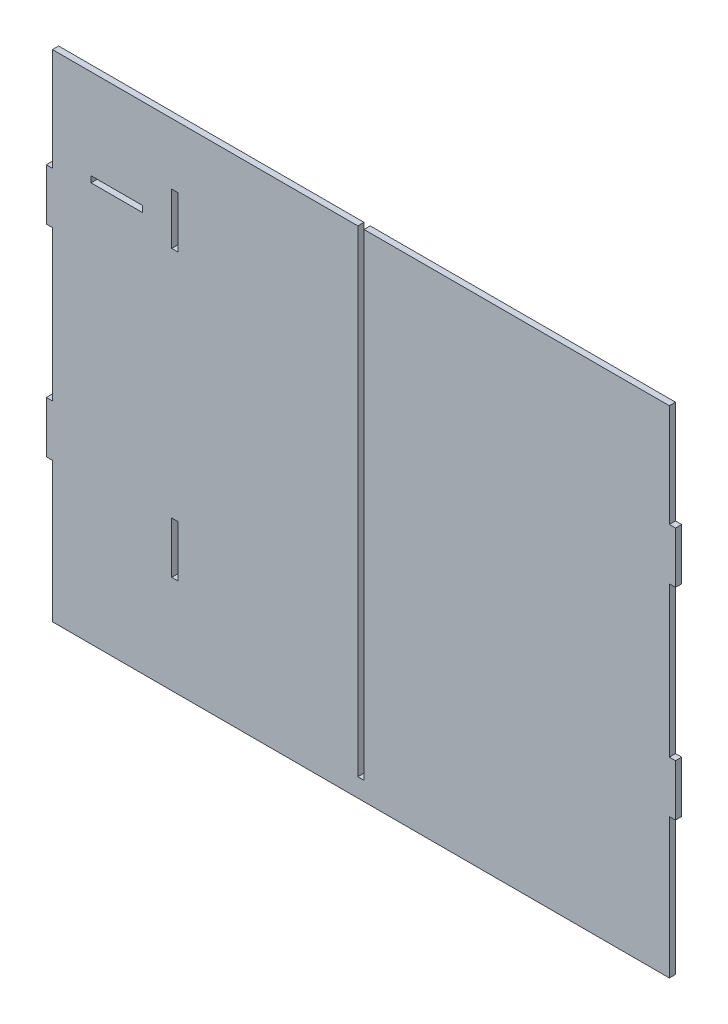
ISO-10303-21;
HEADER;
FILE_DESCRIPTION(('STEP AP214'),'2;1');
FILE_NAME('part.step','',(''),(''),'','','');
FILE_SCHEMA(('AUTOMOTIVE_DESIGN { 1 0 10303 214 1 1 1 1 }'));
ENDSEC;
DATA;
#1=APPLICATION_CONTEXT('core data for automotive mechanical design processes');
#2=APPLICATION_PROTOCOL_DEFINITION('international standard','automotive_design',2000,#1);
#3=PRODUCT_CONTEXT('',#1,'mechanical');
#4=PRODUCT('Part','Part','',(#3));
#5=PRODUCT_RELATED_PRODUCT_CATEGORY('part','',(#4));
#6=PRODUCT_DEFINITION_FORMATION('','',#4);
#7=PRODUCT_DEFINITION_CONTEXT('part definition',#1,'design');
#8=PRODUCT_DEFINITION('design','',#6,#7);
#9=PRODUCT_DEFINITION_SHAPE('','',#8);
#10=(LENGTH_UNIT() NAMED_UNIT(*) SI_UNIT(.MILLI.,.METRE.));
#11=(NAMED_UNIT(*) PLANE_ANGLE_UNIT() SI_UNIT($,.RADIAN.));
#12=(NAMED_UNIT(*) SI_UNIT($,.STERADIAN.) SOLID_ANGLE_UNIT());
#13=UNCERTAINTY_MEASURE_WITH_UNIT(LENGTH_MEASURE(1.E-05),#10,'distance_accuracy_value','');
#14=(GEOMETRIC_REPRESENTATION_CONTEXT(3) GLOBAL_UNCERTAINTY_ASSIGNED_CONTEXT((#13)) GLOBAL_UNIT_ASSIGNED_CONTEXT((#10,
#11,#12)) REPRESENTATION_CONTEXT('',''));
#15=CARTESIAN_POINT('',(0.,0.,0.));
#16=DIRECTION('',(0.,0.,1.));
#17=DIRECTION('',(1.,0.,0.));
#18=AXIS2_PLACEMENT_3D('',#15,#16,#17);
#19=CARTESIAN_POINT('',(0.,0.,6.));
#20=DIRECTION('',(0.,0.,-1.));
#21=DIRECTION('',(-1.,0.,0.));
#22=AXIS2_PLACEMENT_3D('',#19,#20,#21);
#23=PLANE('',#22);
#24=DIRECTION('',(0.,-1.,0.));
#25=VECTOR('',#24,1.);
#26=CARTESIAN_POINT('',(116.,-386.5,6.));
#27=LINE('',#26,#25);
#28=CARTESIAN_POINT('',(116.,-336.5,6.));
#29=VERTEX_POINT('',#28);
#30=CARTESIAN_POINT('',(116.,-386.5,6.));
#31=VERTEX_POINT('',#30);
#32=EDGE_CURVE('E302',#29,#31,#27,.T.);
#33=ORIENTED_EDGE('',*,*,#32,.F.);
#34=DIRECTION('',(-1.,0.,0.));
#35=VECTOR('',#34,1.);
#36=CARTESIAN_POINT('',(116.,-336.5,6.));
#37=LINE('',#36,#35);
#38=CARTESIAN_POINT('',(122.,-336.5,6.));
#39=VERTEX_POINT('',#38);
#40=EDGE_CURVE('E310',#39,#29,#37,.T.);
#41=ORIENTED_EDGE('',*,*,#40,.F.);
#42=DIRECTION('',(0.,1.,0.));
#43=VECTOR('',#42,1.);
#44=CARTESIAN_POINT('',(122.,-386.5,6.));
#45=LINE('',#44,#43);
#46=CARTESIAN_POINT('',(122.,-386.5,6.));
#47=VERTEX_POINT('',#46);
#48=EDGE_CURVE('E307',#47,#39,#45,.T.);
#49=ORIENTED_EDGE('',*,*,#48,.F.);
#50=DIRECTION('',(1.,0.,0.));
#51=VECTOR('',#50,1.);
#52=CARTESIAN_POINT('',(116.,-386.5,6.));
#53=LINE('',#52,#51);
#54=EDGE_CURVE('E304',#31,#47,#53,.T.);
#55=ORIENTED_EDGE('',*,*,#54,.F.);
#56=EDGE_LOOP('',(#33,#41,#49,#55));
#57=FACE_BOUND('',#56,.T.);
#58=DIRECTION('',(0.,-1.,0.));
#59=VECTOR('',#58,1.);
#60=CARTESIAN_POINT('',(0.,0.,6.));
#61=LINE('',#60,#59);
#62=CARTESIAN_POINT('',(0.,0.,6.));
#63=VERTEX_POINT('',#62);
#64=CARTESIAN_POINT('',(0.,-100.,6.));
#65=VERTEX_POINT('',#64);
#66=EDGE_CURVE('E364',#63,#65,#61,.T.);
#67=ORIENTED_EDGE('',*,*,#66,.T.);
#68=DIRECTION('',(-1.,0.,0.));
#69=VECTOR('',#68,1.);
#70=CARTESIAN_POINT('',(0.,-100.,6.));
#71=LINE('',#70,#69);
#72=CARTESIAN_POINT('',(-5.99999999999989,-100.,6.));
#73=VERTEX_POINT('',#72);
#74=EDGE_CURVE('E367',#65,#73,#71,.T.);
#75=ORIENTED_EDGE('',*,*,#74,.T.);
#76=DIRECTION('',(0.,-1.,0.));
#77=VECTOR('',#76,1.);
#78=CARTESIAN_POINT('',(-5.99999999999989,-100.,6.));
#79=LINE('',#78,#77);
#80=CARTESIAN_POINT('',(-5.99999999999989,-150.,6.));
#81=VERTEX_POINT('',#80);
#82=EDGE_CURVE('E370',#73,#81,#79,.T.);
#83=ORIENTED_EDGE('',*,*,#82,.T.);
#84=DIRECTION('',(1.,0.,0.));
#85=VECTOR('',#84,1.);
#86=CARTESIAN_POINT('',(0.,-150.,6.));
#87=LINE('',#86,#85);
#88=CARTESIAN_POINT('',(0.,-150.,6.));
#89=VERTEX_POINT('',#88);
#90=EDGE_CURVE('E372',#81,#89,#87,.T.);
#91=ORIENTED_EDGE('',*,*,#90,.T.);
#92=DIRECTION('',(0.,-1.,0.));
#93=VECTOR('',#92,1.);
#94=CARTESIAN_POINT('',(0.,-150.,6.));
#95=LINE('',#94,#93);
#96=CARTESIAN_POINT('',(0.,-296.,6.));
#97=VERTEX_POINT('',#96);
#98=EDGE_CURVE('E374',#89,#97,#95,.T.);
#99=ORIENTED_EDGE('',*,*,#98,.T.);
#100=DIRECTION('',(-1.,0.,0.));
#101=VECTOR('',#100,1.);
#102=CARTESIAN_POINT('',(0.,-296.,6.));
#103=LINE('',#102,#101);
#104=CARTESIAN_POINT('',(-5.99999999999988,-296.,6.));
#105=VERTEX_POINT('',#104);
#106=EDGE_CURVE('E376',#97,#105,#103,.T.);
#107=ORIENTED_EDGE('',*,*,#106,.T.);
#108=DIRECTION('',(0.,-1.,0.));
#109=VECTOR('',#108,1.);
#110=CARTESIAN_POINT('',(-5.99999999999986,-346.,6.));
#111=LINE('',#110,#109);
#112=CARTESIAN_POINT('',(-5.99999999999986,-346.,6.));
#113=VERTEX_POINT('',#112);
#114=EDGE_CURVE('E378',#105,#113,#111,.T.);
#115=ORIENTED_EDGE('',*,*,#114,.T.);
#116=DIRECTION('',(1.,0.,0.));
#117=VECTOR('',#116,1.);
#118=CARTESIAN_POINT('',(0.,-346.,6.));
#119=LINE('',#118,#117);
#120=CARTESIAN_POINT('',(0.,-346.,6.));
#121=VERTEX_POINT('',#120);
#122=EDGE_CURVE('E380',#113,#121,#119,.T.);
#123=ORIENTED_EDGE('',*,*,#122,.T.);
#124=DIRECTION('',(0.,-1.,0.));
#125=VECTOR('',#124,1.);
#126=CARTESIAN_POINT('',(0.,-346.,6.));
#127=LINE('',#126,#125);
#128=CARTESIAN_POINT('',(0.,-482.,6.));
#129=VERTEX_POINT('',#128);
#130=EDGE_CURVE('E382',#121,#129,#127,.T.);
#131=ORIENTED_EDGE('',*,*,#130,.T.);
#132=DIRECTION('',(1.,0.,0.));
#133=VECTOR('',#132,1.);
#134=CARTESIAN_POINT('',(0.,-482.,6.));
#135=LINE('',#134,#133);
#136=CARTESIAN_POINT('',(600.,-482.,6.));
#137=VERTEX_POINT('',#136);
#138=EDGE_CURVE('E384',#129,#137,#135,.T.);
#139=ORIENTED_EDGE('',*,*,#138,.T.);
#140=DIRECTION('',(0.,1.,0.));
#141=VECTOR('',#140,1.);
#142=CARTESIAN_POINT('',(600.,-346.,6.));
#143=LINE('',#142,#141);
#144=CARTESIAN_POINT('',(600.,-346.,6.));
#145=VERTEX_POINT('',#144);
#146=EDGE_CURVE('E386',#137,#145,#143,.T.);
#147=ORIENTED_EDGE('',*,*,#146,.T.);
#148=DIRECTION('',(1.,0.,0.));
#149=VECTOR('',#148,1.);
#150=CARTESIAN_POINT('',(600.,-346.,6.));
#151=LINE('',#150,#149);
#152=CARTESIAN_POINT('',(606.,-346.,6.));
#153=VERTEX_POINT('',#152);
#154=EDGE_CURVE('E388',#145,#153,#151,.T.);
#155=ORIENTED_EDGE('',*,*,#154,.T.);
#156=DIRECTION('',(0.,1.,0.));
#157=VECTOR('',#156,1.);
#158=CARTESIAN_POINT('',(606.,-346.,6.));
#159=LINE('',#158,#157);
#160=CARTESIAN_POINT('',(606.,-296.,6.));
#161=VERTEX_POINT('',#160);
#162=EDGE_CURVE('E390',#153,#161,#159,.T.);
#163=ORIENTED_EDGE('',*,*,#162,.T.);
#164=DIRECTION('',(-1.,0.,0.));
#165=VECTOR('',#164,1.);
#166=CARTESIAN_POINT('',(600.,-296.,6.));
#167=LINE('',#166,#165);
#168=CARTESIAN_POINT('',(600.,-296.,6.));
#169=VERTEX_POINT('',#168);
#170=EDGE_CURVE('E392',#161,#169,#167,.T.);
#171=ORIENTED_EDGE('',*,*,#170,.T.);
#172=DIRECTION('',(0.,1.,0.));
#173=VECTOR('',#172,1.);
#174=CARTESIAN_POINT('',(600.,-150.,6.));
#175=LINE('',#174,#173);
#176=CARTESIAN_POINT('',(600.,-150.,6.));
#177=VERTEX_POINT('',#176);
#178=EDGE_CURVE('E394',#169,#177,#175,.T.);
#179=ORIENTED_EDGE('',*,*,#178,.T.);
#180=DIRECTION('',(1.,0.,0.));
#181=VECTOR('',#180,1.);
#182=CARTESIAN_POINT('',(600.,-150.,6.));
#183=LINE('',#182,#181);
#184=CARTESIAN_POINT('',(606.,-150.,6.));
#185=VERTEX_POINT('',#184);
#186=EDGE_CURVE('E396',#177,#185,#183,.T.);
#187=ORIENTED_EDGE('',*,*,#186,.T.);
#188=DIRECTION('',(0.,1.,0.));
#189=VECTOR('',#188,1.);
#190=CARTESIAN_POINT('',(606.,-100.,6.));
#191=LINE('',#190,#189);
#192=CARTESIAN_POINT('',(606.,-100.,6.));
#193=VERTEX_POINT('',#192);
#194=EDGE_CURVE('E398',#185,#193,#191,.T.);
#195=ORIENTED_EDGE('',*,*,#194,.T.);
#196=DIRECTION('',(-1.,0.,0.));
#197=VECTOR('',#196,1.);
#198=CARTESIAN_POINT('',(600.,-100.,6.));
#199=LINE('',#198,#197);
#200=CARTESIAN_POINT('',(600.,-100.,6.));
#201=VERTEX_POINT('',#200);
#202=EDGE_CURVE('E400',#193,#201,#199,.T.);
#203=ORIENTED_EDGE('',*,*,#202,.T.);
#204=DIRECTION('',(0.,1.,0.));
#205=VECTOR('',#204,1.);
#206=CARTESIAN_POINT('',(600.,0.,6.));
#207=LINE('',#206,#205);
#208=CARTESIAN_POINT('',(600.,0.,6.));
#209=VERTEX_POINT('',#208);
#210=EDGE_CURVE('E402',#201,#209,#207,.T.);
#211=ORIENTED_EDGE('',*,*,#210,.T.);
#212=DIRECTION('',(-1.,0.,0.));
#213=VECTOR('',#212,1.);
#214=CARTESIAN_POINT('',(303.,0.,6.));
#215=LINE('',#214,#213);
#216=CARTESIAN_POINT('',(303.,0.,6.));
#217=VERTEX_POINT('',#216);
#218=EDGE_CURVE('E404',#209,#217,#215,.T.);
#219=ORIENTED_EDGE('',*,*,#218,.T.);
#220=DIRECTION('',(0.,-1.,0.));
#221=VECTOR('',#220,1.);
#222=CARTESIAN_POINT('',(303.,0.,6.));
#223=LINE('',#222,#221);
#224=CARTESIAN_POINT('',(303.,-464.,6.));
#225=VERTEX_POINT('',#224);
#226=EDGE_CURVE('E406',#217,#225,#223,.T.);
#227=ORIENTED_EDGE('',*,*,#226,.T.);
#228=DIRECTION('',(-1.,0.,0.));
#229=VECTOR('',#228,1.);
#230=CARTESIAN_POINT('',(297.,-464.,6.));
#231=LINE('',#230,#229);
#232=CARTESIAN_POINT('',(297.,-464.,6.));
#233=VERTEX_POINT('',#232);
#234=EDGE_CURVE('E408',#225,#233,#231,.T.);
#235=ORIENTED_EDGE('',*,*,#234,.T.);
#236=DIRECTION('',(0.,1.,0.));
#237=VECTOR('',#236,1.);
#238=CARTESIAN_POINT('',(297.,0.,6.));
#239=LINE('',#238,#237);
#240=CARTESIAN_POINT('',(297.,0.,6.));
#241=VERTEX_POINT('',#240);
#242=EDGE_CURVE('E410',#233,#241,#239,.T.);
#243=ORIENTED_EDGE('',*,*,#242,.T.);
#244=DIRECTION('',(-1.,0.,0.));
#245=VECTOR('',#244,1.);
#246=CARTESIAN_POINT('',(0.,0.,6.));
#247=LINE('',#246,#245);
#248=EDGE_CURVE('E412',#241,#63,#247,.T.);
#249=ORIENTED_EDGE('',*,*,#248,.T.);
#250=EDGE_LOOP('',(#67,#75,#83,#91,#99,#107,#115,#123,#131,#139,#147,#155,#163,#171,#179,#187,
#195,#203,#211,#219,#227,#235,#243,#249));
#251=FACE_BOUND('',#250,.T.);
#252=DIRECTION('',(0.,1.,0.));
#253=VECTOR('',#252,1.);
#254=CARTESIAN_POINT('',(122.,-59.5,6.));
#255=LINE('',#254,#253);
#256=CARTESIAN_POINT('',(122.,-109.5,6.));
#257=VERTEX_POINT('',#256);
#258=CARTESIAN_POINT('',(122.,-59.5,6.));
#259=VERTEX_POINT('',#258);
#260=EDGE_CURVE('E333',#257,#259,#255,.T.);
#261=ORIENTED_EDGE('',*,*,#260,.F.);
#262=DIRECTION('',(1.,0.,0.));
#263=VECTOR('',#262,1.);
#264=CARTESIAN_POINT('',(116.,-109.5,6.));
#265=LINE('',#264,#263);
#266=CARTESIAN_POINT('',(116.,-109.5,6.));
#267=VERTEX_POINT('',#266);
#268=EDGE_CURVE('E341',#267,#257,#265,.T.);
#269=ORIENTED_EDGE('',*,*,#268,.F.);
#270=DIRECTION('',(0.,-1.,0.));
#271=VECTOR('',#270,1.);
#272=CARTESIAN_POINT('',(116.,-59.5,6.));
#273=LINE('',#272,#271);
#274=CARTESIAN_POINT('',(116.,-59.5,6.));
#275=VERTEX_POINT('',#274);
#276=EDGE_CURVE('E338',#275,#267,#273,.T.);
#277=ORIENTED_EDGE('',*,*,#276,.F.);
#278=DIRECTION('',(-1.,0.,0.));
#279=VECTOR('',#278,1.);
#280=CARTESIAN_POINT('',(116.,-59.5,6.));
#281=LINE('',#280,#279);
#282=EDGE_CURVE('E335',#259,#275,#281,.T.);
#283=ORIENTED_EDGE('',*,*,#282,.F.);
#284=EDGE_LOOP('',(#261,#269,#277,#283));
#285=FACE_BOUND('',#284,.T.);
#286=DIRECTION('',(0.,1.,0.));
#287=VECTOR('',#286,1.);
#288=CARTESIAN_POINT('',(87.5,-87.5,6.));
#289=LINE('',#288,#287);
#290=CARTESIAN_POINT('',(87.5,-93.5,6.));
#291=VERTEX_POINT('',#290);
#292=CARTESIAN_POINT('',(87.5,-87.5,6.));
#293=VERTEX_POINT('',#292);
#294=EDGE_CURVE('E266',#291,#293,#289,.T.);
#295=ORIENTED_EDGE('',*,*,#294,.F.);
#296=DIRECTION('',(1.,0.,0.));
#297=VECTOR('',#296,1.);
#298=CARTESIAN_POINT('',(37.5,-93.5,6.));
#299=LINE('',#298,#297);
#300=CARTESIAN_POINT('',(37.5,-93.5,6.));
#301=VERTEX_POINT('',#300);
#302=EDGE_CURVE('E288',#301,#291,#299,.T.);
#303=ORIENTED_EDGE('',*,*,#302,.F.);
#304=DIRECTION('',(0.,-1.,0.));
#305=VECTOR('',#304,1.);
#306=CARTESIAN_POINT('',(37.5,-87.5,6.));
#307=LINE('',#306,#305);
#308=CARTESIAN_POINT('',(37.5,-87.5,6.));
#309=VERTEX_POINT('',#308);
#310=EDGE_CURVE('E286',#309,#301,#307,.T.);
#311=ORIENTED_EDGE('',*,*,#310,.F.);
#312=DIRECTION('',(-1.,0.,0.));
#313=VECTOR('',#312,1.);
#314=CARTESIAN_POINT('',(37.5,-87.5,6.));
#315=LINE('',#314,#313);
#316=EDGE_CURVE('E274',#293,#309,#315,.T.);
#317=ORIENTED_EDGE('',*,*,#316,.F.);
#318=EDGE_LOOP('',(#295,#303,#311,#317));
#319=FACE_BOUND('',#318,.T.);
#320=ADVANCED_FACE('F33',(#57,#251,#285,#319),#23,.F.);
#321=CARTESIAN_POINT('',(0.,0.,0.));
#322=DIRECTION('',(0.,0.,-1.));
#323=DIRECTION('',(-1.,0.,0.));
#324=AXIS2_PLACEMENT_3D('',#321,#322,#323);
#325=PLANE('',#324);
#326=DIRECTION('',(0.,-1.,0.));
#327=VECTOR('',#326,1.);
#328=CARTESIAN_POINT('',(0.,0.,0.));
#329=LINE('',#328,#327);
#330=CARTESIAN_POINT('',(0.,0.,0.));
#331=VERTEX_POINT('',#330);
#332=CARTESIAN_POINT('',(0.,-100.,0.));
#333=VERTEX_POINT('',#332);
#334=EDGE_CURVE('E363',#331,#333,#329,.T.);
#335=ORIENTED_EDGE('',*,*,#334,.F.);
#336=DIRECTION('',(-1.,0.,0.));
#337=VECTOR('',#336,1.);
#338=CARTESIAN_POINT('',(0.,0.,0.));
#339=LINE('',#338,#337);
#340=CARTESIAN_POINT('',(297.,0.,0.));
#341=VERTEX_POINT('',#340);
#342=EDGE_CURVE('E368',#341,#331,#339,.T.);
#343=ORIENTED_EDGE('',*,*,#342,.F.);
#344=DIRECTION('',(0.,1.,0.));
#345=VECTOR('',#344,1.);
#346=CARTESIAN_POINT('',(297.,0.,0.));
#347=LINE('',#346,#345);
#348=CARTESIAN_POINT('',(297.,-464.,0.));
#349=VERTEX_POINT('',#348);
#350=EDGE_CURVE('E459',#349,#341,#347,.T.);
#351=ORIENTED_EDGE('',*,*,#350,.F.);
#352=DIRECTION('',(-1.,0.,0.));
#353=VECTOR('',#352,1.);
#354=CARTESIAN_POINT('',(297.,-464.,0.));
#355=LINE('',#354,#353);
#356=CARTESIAN_POINT('',(303.,-464.,0.));
#357=VERTEX_POINT('',#356);
#358=EDGE_CURVE('E457',#357,#349,#355,.T.);
#359=ORIENTED_EDGE('',*,*,#358,.F.);
#360=DIRECTION('',(0.,-1.,0.));
#361=VECTOR('',#360,1.);
#362=CARTESIAN_POINT('',(303.,0.,0.));
#363=LINE('',#362,#361);
#364=CARTESIAN_POINT('',(303.,0.,0.));
#365=VERTEX_POINT('',#364);
#366=EDGE_CURVE('E455',#365,#357,#363,.T.);
#367=ORIENTED_EDGE('',*,*,#366,.F.);
#368=DIRECTION('',(-1.,0.,0.));
#369=VECTOR('',#368,1.);
#370=CARTESIAN_POINT('',(303.,0.,0.));
#371=LINE('',#370,#369);
#372=CARTESIAN_POINT('',(600.,0.,0.));
#373=VERTEX_POINT('',#372);
#374=EDGE_CURVE('E453',#373,#365,#371,.T.);
#375=ORIENTED_EDGE('',*,*,#374,.F.);
#376=DIRECTION('',(0.,1.,0.));
#377=VECTOR('',#376,1.);
#378=CARTESIAN_POINT('',(600.,0.,0.));
#379=LINE('',#378,#377);
#380=CARTESIAN_POINT('',(600.,-100.,0.));
#381=VERTEX_POINT('',#380);
#382=EDGE_CURVE('E451',#381,#373,#379,.T.);
#383=ORIENTED_EDGE('',*,*,#382,.F.);
#384=DIRECTION('',(-1.,0.,0.));
#385=VECTOR('',#384,1.);
#386=CARTESIAN_POINT('',(600.,-100.,0.));
#387=LINE('',#386,#385);
#388=CARTESIAN_POINT('',(606.,-100.,0.));
#389=VERTEX_POINT('',#388);
#390=EDGE_CURVE('E449',#389,#381,#387,.T.);
#391=ORIENTED_EDGE('',*,*,#390,.F.);
#392=DIRECTION('',(0.,1.,0.));
#393=VECTOR('',#392,1.);
#394=CARTESIAN_POINT('',(606.,-100.,0.));
#395=LINE('',#394,#393);
#396=CARTESIAN_POINT('',(606.,-150.,0.));
#397=VERTEX_POINT('',#396);
#398=EDGE_CURVE('E447',#397,#389,#395,.T.);
#399=ORIENTED_EDGE('',*,*,#398,.F.);
#400=DIRECTION('',(1.,0.,0.));
#401=VECTOR('',#400,1.);
#402=CARTESIAN_POINT('',(600.,-150.,0.));
#403=LINE('',#402,#401);
#404=CARTESIAN_POINT('',(600.,-150.,0.));
#405=VERTEX_POINT('',#404);
#406=EDGE_CURVE('E445',#405,#397,#403,.T.);
#407=ORIENTED_EDGE('',*,*,#406,.F.);
#408=DIRECTION('',(0.,1.,0.));
#409=VECTOR('',#408,1.);
#410=CARTESIAN_POINT('',(600.,-150.,0.));
#411=LINE('',#410,#409);
#412=CARTESIAN_POINT('',(600.,-296.,0.));
#413=VERTEX_POINT('',#412);
#414=EDGE_CURVE('E443',#413,#405,#411,.T.);
#415=ORIENTED_EDGE('',*,*,#414,.F.);
#416=DIRECTION('',(-1.,0.,0.));
#417=VECTOR('',#416,1.);
#418=CARTESIAN_POINT('',(600.,-296.,0.));
#419=LINE('',#418,#417);
#420=CARTESIAN_POINT('',(606.,-296.,0.));
#421=VERTEX_POINT('',#420);
#422=EDGE_CURVE('E441',#421,#413,#419,.T.);
#423=ORIENTED_EDGE('',*,*,#422,.F.);
#424=DIRECTION('',(0.,1.,0.));
#425=VECTOR('',#424,1.);
#426=CARTESIAN_POINT('',(606.,-346.,0.));
#427=LINE('',#426,#425);
#428=CARTESIAN_POINT('',(606.,-346.,0.));
#429=VERTEX_POINT('',#428);
#430=EDGE_CURVE('E439',#429,#421,#427,.T.);
#431=ORIENTED_EDGE('',*,*,#430,.F.);
#432=DIRECTION('',(1.,0.,0.));
#433=VECTOR('',#432,1.);
#434=CARTESIAN_POINT('',(600.,-346.,0.));
#435=LINE('',#434,#433);
#436=CARTESIAN_POINT('',(600.,-346.,0.));
#437=VERTEX_POINT('',#436);
#438=EDGE_CURVE('E437',#437,#429,#435,.T.);
#439=ORIENTED_EDGE('',*,*,#438,.F.);
#440=DIRECTION('',(0.,1.,0.));
#441=VECTOR('',#440,1.);
#442=CARTESIAN_POINT('',(600.,-346.,0.));
#443=LINE('',#442,#441);
#444=CARTESIAN_POINT('',(600.,-482.,0.));
#445=VERTEX_POINT('',#444);
#446=EDGE_CURVE('E435',#445,#437,#443,.T.);
#447=ORIENTED_EDGE('',*,*,#446,.F.);
#448=DIRECTION('',(1.,0.,0.));
#449=VECTOR('',#448,1.);
#450=CARTESIAN_POINT('',(0.,-482.,0.));
#451=LINE('',#450,#449);
#452=CARTESIAN_POINT('',(0.,-482.,0.));
#453=VERTEX_POINT('',#452);
#454=EDGE_CURVE('E433',#453,#445,#451,.T.);
#455=ORIENTED_EDGE('',*,*,#454,.F.);
#456=DIRECTION('',(0.,-1.,0.));
#457=VECTOR('',#456,1.);
#458=CARTESIAN_POINT('',(0.,-346.,0.));
#459=LINE('',#458,#457);
#460=CARTESIAN_POINT('',(0.,-346.,0.));
#461=VERTEX_POINT('',#460);
#462=EDGE_CURVE('E431',#461,#453,#459,.T.);
#463=ORIENTED_EDGE('',*,*,#462,.F.);
#464=DIRECTION('',(1.,0.,0.));
#465=VECTOR('',#464,1.);
#466=CARTESIAN_POINT('',(0.,-346.,0.));
#467=LINE('',#466,#465);
#468=CARTESIAN_POINT('',(-5.99999999999986,-346.,0.));
#469=VERTEX_POINT('',#468);
#470=EDGE_CURVE('E429',#469,#461,#467,.T.);
#471=ORIENTED_EDGE('',*,*,#470,.F.);
#472=DIRECTION('',(0.,-1.,0.));
#473=VECTOR('',#472,1.);
#474=CARTESIAN_POINT('',(-5.99999999999986,-346.,0.));
#475=LINE('',#474,#473);
#476=CARTESIAN_POINT('',(-5.99999999999988,-296.,0.));
#477=VERTEX_POINT('',#476);
#478=EDGE_CURVE('E427',#477,#469,#475,.T.);
#479=ORIENTED_EDGE('',*,*,#478,.F.);
#480=DIRECTION('',(-1.,0.,0.));
#481=VECTOR('',#480,1.);
#482=CARTESIAN_POINT('',(0.,-296.,0.));
#483=LINE('',#482,#481);
#484=CARTESIAN_POINT('',(0.,-296.,0.));
#485=VERTEX_POINT('',#484);
#486=EDGE_CURVE('E425',#485,#477,#483,.T.);
#487=ORIENTED_EDGE('',*,*,#486,.F.);
#488=DIRECTION('',(0.,-1.,0.));
#489=VECTOR('',#488,1.);
#490=CARTESIAN_POINT('',(0.,-150.,0.));
#491=LINE('',#490,#489);
#492=CARTESIAN_POINT('',(0.,-150.,0.));
#493=VERTEX_POINT('',#492);
#494=EDGE_CURVE('E423',#493,#485,#491,.T.);
#495=ORIENTED_EDGE('',*,*,#494,.F.);
#496=DIRECTION('',(1.,0.,0.));
#497=VECTOR('',#496,1.);
#498=CARTESIAN_POINT('',(0.,-150.,0.));
#499=LINE('',#498,#497);
#500=CARTESIAN_POINT('',(-5.99999999999989,-150.,0.));
#501=VERTEX_POINT('',#500);
#502=EDGE_CURVE('E421',#501,#493,#499,.T.);
#503=ORIENTED_EDGE('',*,*,#502,.F.);
#504=DIRECTION('',(0.,-1.,0.));
#505=VECTOR('',#504,1.);
#506=CARTESIAN_POINT('',(-5.99999999999989,-100.,0.));
#507=LINE('',#506,#505);
#508=CARTESIAN_POINT('',(-5.99999999999989,-100.,0.));
#509=VERTEX_POINT('',#508);
#510=EDGE_CURVE('E419',#509,#501,#507,.T.);
#511=ORIENTED_EDGE('',*,*,#510,.F.);
#512=DIRECTION('',(-1.,0.,0.));
#513=VECTOR('',#512,1.);
#514=CARTESIAN_POINT('',(0.,-100.,0.));
#515=LINE('',#514,#513);
#516=EDGE_CURVE('E417',#333,#509,#515,.T.);
#517=ORIENTED_EDGE('',*,*,#516,.F.);
#518=EDGE_LOOP('',(#335,#343,#351,#359,#367,#375,#383,#391,#399,#407,#415,#423,#431,#439,#447,
#455,#463,#471,#479,#487,#495,#503,#511,#517));
#519=FACE_BOUND('',#518,.T.);
#520=DIRECTION('',(1.,0.,0.));
#521=VECTOR('',#520,1.);
#522=CARTESIAN_POINT('',(116.,-109.5,0.));
#523=LINE('',#522,#521);
#524=CARTESIAN_POINT('',(116.,-109.5,0.));
#525=VERTEX_POINT('',#524);
#526=CARTESIAN_POINT('',(122.,-109.5,0.));
#527=VERTEX_POINT('',#526);
#528=EDGE_CURVE('E336',#525,#527,#523,.T.);
#529=ORIENTED_EDGE('',*,*,#528,.T.);
#530=DIRECTION('',(0.,1.,0.));
#531=VECTOR('',#530,1.);
#532=CARTESIAN_POINT('',(122.,-59.5,0.));
#533=LINE('',#532,#531);
#534=CARTESIAN_POINT('',(122.,-59.5,0.));
#535=VERTEX_POINT('',#534);
#536=EDGE_CURVE('E332',#527,#535,#533,.T.);
#537=ORIENTED_EDGE('',*,*,#536,.T.);
#538=DIRECTION('',(-1.,0.,0.));
#539=VECTOR('',#538,1.);
#540=CARTESIAN_POINT('',(116.,-59.5,0.));
#541=LINE('',#540,#539);
#542=CARTESIAN_POINT('',(116.,-59.5,0.));
#543=VERTEX_POINT('',#542);
#544=EDGE_CURVE('E346',#535,#543,#541,.T.);
#545=ORIENTED_EDGE('',*,*,#544,.T.);
#546=DIRECTION('',(0.,-1.,0.));
#547=VECTOR('',#546,1.);
#548=CARTESIAN_POINT('',(116.,-59.5,0.));
#549=LINE('',#548,#547);
#550=EDGE_CURVE('E349',#543,#525,#549,.T.);
#551=ORIENTED_EDGE('',*,*,#550,.T.);
#552=EDGE_LOOP('',(#529,#537,#545,#551));
#553=FACE_BOUND('',#552,.T.);
#554=DIRECTION('',(-1.,0.,0.));
#555=VECTOR('',#554,1.);
#556=CARTESIAN_POINT('',(116.,-336.5,0.));
#557=LINE('',#556,#555);
#558=CARTESIAN_POINT('',(122.,-336.5,0.));
#559=VERTEX_POINT('',#558);
#560=CARTESIAN_POINT('',(116.,-336.5,0.));
#561=VERTEX_POINT('',#560);
#562=EDGE_CURVE('E305',#559,#561,#557,.T.);
#563=ORIENTED_EDGE('',*,*,#562,.T.);
#564=DIRECTION('',(0.,-1.,0.));
#565=VECTOR('',#564,1.);
#566=CARTESIAN_POINT('',(116.,-386.5,0.));
#567=LINE('',#566,#565);
#568=CARTESIAN_POINT('',(116.,-386.5,0.));
#569=VERTEX_POINT('',#568);
#570=EDGE_CURVE('E282',#561,#569,#567,.T.);
#571=ORIENTED_EDGE('',*,*,#570,.T.);
#572=DIRECTION('',(1.,0.,0.));
#573=VECTOR('',#572,1.);
#574=CARTESIAN_POINT('',(116.,-386.5,0.));
#575=LINE('',#574,#573);
#576=CARTESIAN_POINT('',(122.,-386.5,0.));
#577=VERTEX_POINT('',#576);
#578=EDGE_CURVE('E315',#569,#577,#575,.T.);
#579=ORIENTED_EDGE('',*,*,#578,.T.);
#580=DIRECTION('',(0.,1.,0.));
#581=VECTOR('',#580,1.);
#582=CARTESIAN_POINT('',(122.,-386.5,0.));
#583=LINE('',#582,#581);
#584=EDGE_CURVE('E318',#577,#559,#583,.T.);
#585=ORIENTED_EDGE('',*,*,#584,.T.);
#586=EDGE_LOOP('',(#563,#571,#579,#585));
#587=FACE_BOUND('',#586,.T.);
#588=DIRECTION('',(1.,0.,0.));
#589=VECTOR('',#588,1.);
#590=CARTESIAN_POINT('',(37.5,-93.5,0.));
#591=LINE('',#590,#589);
#592=CARTESIAN_POINT('',(37.5,-93.5,0.));
#593=VERTEX_POINT('',#592);
#594=CARTESIAN_POINT('',(87.5,-93.5,0.));
#595=VERTEX_POINT('',#594);
#596=EDGE_CURVE('E275',#593,#595,#591,.T.);
#597=ORIENTED_EDGE('',*,*,#596,.T.);
#598=DIRECTION('',(0.,1.,0.));
#599=VECTOR('',#598,1.);
#600=CARTESIAN_POINT('',(87.5,-87.5,0.));
#601=LINE('',#600,#599);
#602=CARTESIAN_POINT('',(87.5,-87.5,0.));
#603=VERTEX_POINT('',#602);
#604=EDGE_CURVE('E56',#595,#603,#601,.T.);
#605=ORIENTED_EDGE('',*,*,#604,.T.);
#606=DIRECTION('',(-1.,0.,0.));
#607=VECTOR('',#606,1.);
#608=CARTESIAN_POINT('',(37.5,-87.5,0.));
#609=LINE('',#608,#607);
#610=CARTESIAN_POINT('',(37.5,-87.5,0.));
#611=VERTEX_POINT('',#610);
#612=EDGE_CURVE('E281',#603,#611,#609,.T.);
#613=ORIENTED_EDGE('',*,*,#612,.T.);
#614=DIRECTION('',(0.,-1.,0.));
#615=VECTOR('',#614,1.);
#616=CARTESIAN_POINT('',(37.5,-87.5,0.));
#617=LINE('',#616,#615);
#618=EDGE_CURVE('E294',#611,#593,#617,.T.);
#619=ORIENTED_EDGE('',*,*,#618,.T.);
#620=EDGE_LOOP('',(#597,#605,#613,#619));
#621=FACE_BOUND('',#620,.T.);
#622=ADVANCED_FACE('F537',(#519,#553,#587,#621),#325,.T.);
#623=CARTESIAN_POINT('',(0.,0.,6.));
#624=DIRECTION('',(1.,0.,0.));
#625=DIRECTION('',(0.,1.,0.));
#626=AXIS2_PLACEMENT_3D('',#623,#624,#625);
#627=PLANE('',#626);
#628=ORIENTED_EDGE('',*,*,#334,.T.);
#629=DIRECTION('',(0.,0.,-1.));
#630=VECTOR('',#629,1.);
#631=CARTESIAN_POINT('',(0.,-100.,6.));
#632=LINE('',#631,#630);
#633=EDGE_CURVE('E11',#65,#333,#632,.T.);
#634=ORIENTED_EDGE('',*,*,#633,.F.);
#635=ORIENTED_EDGE('',*,*,#66,.F.);
#636=DIRECTION('',(0.,0.,-1.));
#637=VECTOR('',#636,1.);
#638=CARTESIAN_POINT('',(0.,0.,6.));
#639=LINE('',#638,#637);
#640=EDGE_CURVE('E414',#63,#331,#639,.T.);
#641=ORIENTED_EDGE('',*,*,#640,.T.);
#642=EDGE_LOOP('',(#628,#634,#635,#641));
#643=FACE_BOUND('',#642,.T.);
#644=ADVANCED_FACE('F35',(#643),#627,.F.);
#645=CARTESIAN_POINT('',(0.,-100.,6.));
#646=DIRECTION('',(0.,-1.,0.));
#647=DIRECTION('',(0.,0.,-1.));
#648=AXIS2_PLACEMENT_3D('',#645,#646,#647);
#649=PLANE('',#648);
#650=ORIENTED_EDGE('',*,*,#516,.T.);
#651=DIRECTION('',(0.,0.,-1.));
#652=VECTOR('',#651,1.);
#653=CARTESIAN_POINT('',(-5.99999999999989,-100.,6.));
#654=LINE('',#653,#652);
#655=EDGE_CURVE('E41',#73,#509,#654,.T.);
#656=ORIENTED_EDGE('',*,*,#655,.F.);
#657=ORIENTED_EDGE('',*,*,#74,.F.);
#658=ORIENTED_EDGE('',*,*,#633,.T.);
#659=EDGE_LOOP('',(#650,#656,#657,#658));
#660=FACE_BOUND('',#659,.T.);
#661=ADVANCED_FACE('F555',(#660),#649,.F.);
#662=CARTESIAN_POINT('',(-5.99999999999989,-100.,6.));
#663=DIRECTION('',(1.,0.,0.));
#664=DIRECTION('',(0.,0.,-1.));
#665=AXIS2_PLACEMENT_3D('',#662,#663,#664);
#666=PLANE('',#665);
#667=ORIENTED_EDGE('',*,*,#510,.T.);
#668=DIRECTION('',(0.,0.,-1.));
#669=VECTOR('',#668,1.);
#670=CARTESIAN_POINT('',(-5.99999999999989,-150.,6.));
#671=LINE('',#670,#669);
#672=EDGE_CURVE('E524',#81,#501,#671,.T.);
#673=ORIENTED_EDGE('',*,*,#672,.F.);
#674=ORIENTED_EDGE('',*,*,#82,.F.);
#675=ORIENTED_EDGE('',*,*,#655,.T.);
#676=EDGE_LOOP('',(#667,#673,#674,#675));
#677=FACE_BOUND('',#676,.T.);
#678=ADVANCED_FACE('F531',(#677),#666,.F.);
#679=CARTESIAN_POINT('',(0.,-150.,6.));
#680=DIRECTION('',(0.,1.,0.));
#681=DIRECTION('',(0.,0.,1.));
#682=AXIS2_PLACEMENT_3D('',#679,#680,#681);
#683=PLANE('',#682);
#684=ORIENTED_EDGE('',*,*,#502,.T.);
#685=DIRECTION('',(0.,0.,-1.));
#686=VECTOR('',#685,1.);
#687=CARTESIAN_POINT('',(0.,-150.,6.));
#688=LINE('',#687,#686);
#689=EDGE_CURVE('E521',#89,#493,#688,.T.);
#690=ORIENTED_EDGE('',*,*,#689,.F.);
#691=ORIENTED_EDGE('',*,*,#90,.F.);
#692=ORIENTED_EDGE('',*,*,#672,.T.);
#693=EDGE_LOOP('',(#684,#690,#691,#692));
#694=FACE_BOUND('',#693,.T.);
#695=ADVANCED_FACE('F543',(#694),#683,.F.);
#696=CARTESIAN_POINT('',(0.,-150.,6.));
#697=DIRECTION('',(1.,0.,0.));
#698=DIRECTION('',(0.,1.,0.));
#699=AXIS2_PLACEMENT_3D('',#696,#697,#698);
#700=PLANE('',#699);
#701=ORIENTED_EDGE('',*,*,#494,.T.);
#702=DIRECTION('',(0.,0.,-1.));
#703=VECTOR('',#702,1.);
#704=CARTESIAN_POINT('',(0.,-296.,6.));
#705=LINE('',#704,#703);
#706=EDGE_CURVE('E518',#97,#485,#705,.T.);
#707=ORIENTED_EDGE('',*,*,#706,.F.);
#708=ORIENTED_EDGE('',*,*,#98,.F.);
#709=ORIENTED_EDGE('',*,*,#689,.T.);
#710=EDGE_LOOP('',(#701,#707,#708,#709));
#711=FACE_BOUND('',#710,.T.);
#712=ADVANCED_FACE('F547',(#711),#700,.F.);
#713=CARTESIAN_POINT('',(0.,-296.,6.));
#714=DIRECTION('',(0.,-1.,0.));
#715=DIRECTION('',(0.,0.,-1.));
#716=AXIS2_PLACEMENT_3D('',#713,#714,#715);
#717=PLANE('',#716);
#718=ORIENTED_EDGE('',*,*,#486,.T.);
#719=DIRECTION('',(0.,0.,-1.));
#720=VECTOR('',#719,1.);
#721=CARTESIAN_POINT('',(-5.99999999999988,-296.,6.));
#722=LINE('',#721,#720);
#723=EDGE_CURVE('E515',#105,#477,#722,.T.);
#724=ORIENTED_EDGE('',*,*,#723,.F.);
#725=ORIENTED_EDGE('',*,*,#106,.F.);
#726=ORIENTED_EDGE('',*,*,#706,.T.);
#727=EDGE_LOOP('',(#718,#724,#725,#726));
#728=FACE_BOUND('',#727,.T.);
#729=ADVANCED_FACE('F648',(#728),#717,.F.);
#730=CARTESIAN_POINT('',(-5.99999999999986,-346.,6.));
#731=DIRECTION('',(1.,0.,0.));
#732=DIRECTION('',(0.,1.,0.));
#733=AXIS2_PLACEMENT_3D('',#730,#731,#732);
#734=PLANE('',#733);
#735=ORIENTED_EDGE('',*,*,#478,.T.);
#736=DIRECTION('',(0.,0.,-1.));
#737=VECTOR('',#736,1.);
#738=CARTESIAN_POINT('',(-5.99999999999986,-346.,6.));
#739=LINE('',#738,#737);
#740=EDGE_CURVE('E512',#113,#469,#739,.T.);
#741=ORIENTED_EDGE('',*,*,#740,.F.);
#742=ORIENTED_EDGE('',*,*,#114,.F.);
#743=ORIENTED_EDGE('',*,*,#723,.T.);
#744=EDGE_LOOP('',(#735,#741,#742,#743));
#745=FACE_BOUND('',#744,.T.);
#746=ADVANCED_FACE('F646',(#745),#734,.F.);
#747=CARTESIAN_POINT('',(0.,-346.,6.));
#748=DIRECTION('',(0.,1.,0.));
#749=DIRECTION('',(0.,0.,1.));
#750=AXIS2_PLACEMENT_3D('',#747,#748,#749);
#751=PLANE('',#750);
#752=ORIENTED_EDGE('',*,*,#470,.T.);
#753=DIRECTION('',(0.,0.,-1.));
#754=VECTOR('',#753,1.);
#755=CARTESIAN_POINT('',(0.,-346.,6.));
#756=LINE('',#755,#754);
#757=EDGE_CURVE('E509',#121,#461,#756,.T.);
#758=ORIENTED_EDGE('',*,*,#757,.F.);
#759=ORIENTED_EDGE('',*,*,#122,.F.);
#760=ORIENTED_EDGE('',*,*,#740,.T.);
#761=EDGE_LOOP('',(#752,#758,#759,#760));
#762=FACE_BOUND('',#761,.T.);
#763=ADVANCED_FACE('F642',(#762),#751,.F.);
#764=CARTESIAN_POINT('',(0.,-346.,6.));
#765=DIRECTION('',(1.,0.,0.));
#766=DIRECTION('',(0.,1.,0.));
#767=AXIS2_PLACEMENT_3D('',#764,#765,#766);
#768=PLANE('',#767);
#769=ORIENTED_EDGE('',*,*,#462,.T.);
#770=DIRECTION('',(0.,0.,-1.));
#771=VECTOR('',#770,1.);
#772=CARTESIAN_POINT('',(0.,-482.,6.));
#773=LINE('',#772,#771);
#774=EDGE_CURVE('E506',#129,#453,#773,.T.);
#775=ORIENTED_EDGE('',*,*,#774,.F.);
#776=ORIENTED_EDGE('',*,*,#130,.F.);
#777=ORIENTED_EDGE('',*,*,#757,.T.);
#778=EDGE_LOOP('',(#769,#775,#776,#777));
#779=FACE_BOUND('',#778,.T.);
#780=ADVANCED_FACE('F637',(#779),#768,.F.);
#781=CARTESIAN_POINT('',(0.,-482.,6.));
#782=DIRECTION('',(0.,1.,0.));
#783=DIRECTION('',(0.,0.,1.));
#784=AXIS2_PLACEMENT_3D('',#781,#782,#783);
#785=PLANE('',#784);
#786=ORIENTED_EDGE('',*,*,#454,.T.);
#787=DIRECTION('',(0.,0.,-1.));
#788=VECTOR('',#787,1.);
#789=CARTESIAN_POINT('',(600.,-482.,6.));
#790=LINE('',#789,#788);
#791=EDGE_CURVE('E503',#137,#445,#790,.T.);
#792=ORIENTED_EDGE('',*,*,#791,.F.);
#793=ORIENTED_EDGE('',*,*,#138,.F.);
#794=ORIENTED_EDGE('',*,*,#774,.T.);
#795=EDGE_LOOP('',(#786,#792,#793,#794));
#796=FACE_BOUND('',#795,.T.);
#797=ADVANCED_FACE('F631',(#796),#785,.F.);
#798=CARTESIAN_POINT('',(600.,-346.,6.));
#799=DIRECTION('',(-1.,0.,0.));
#800=DIRECTION('',(0.,-1.,0.));
#801=AXIS2_PLACEMENT_3D('',#798,#799,#800);
#802=PLANE('',#801);
#803=ORIENTED_EDGE('',*,*,#446,.T.);
#804=DIRECTION('',(0.,0.,-1.));
#805=VECTOR('',#804,1.);
#806=CARTESIAN_POINT('',(600.,-346.,6.));
#807=LINE('',#806,#805);
#808=EDGE_CURVE('E500',#145,#437,#807,.T.);
#809=ORIENTED_EDGE('',*,*,#808,.F.);
#810=ORIENTED_EDGE('',*,*,#146,.F.);
#811=ORIENTED_EDGE('',*,*,#791,.T.);
#812=EDGE_LOOP('',(#803,#809,#810,#811));
#813=FACE_BOUND('',#812,.T.);
#814=ADVANCED_FACE('F627',(#813),#802,.F.);
#815=CARTESIAN_POINT('',(600.,-346.,6.));
#816=DIRECTION('',(0.,1.,0.));
#817=DIRECTION('',(0.,0.,1.));
#818=AXIS2_PLACEMENT_3D('',#815,#816,#817);
#819=PLANE('',#818);
#820=ORIENTED_EDGE('',*,*,#438,.T.);
#821=DIRECTION('',(0.,0.,-1.));
#822=VECTOR('',#821,1.);
#823=CARTESIAN_POINT('',(606.,-346.,6.));
#824=LINE('',#823,#822);
#825=EDGE_CURVE('E497',#153,#429,#824,.T.);
#826=ORIENTED_EDGE('',*,*,#825,.F.);
#827=ORIENTED_EDGE('',*,*,#154,.F.);
#828=ORIENTED_EDGE('',*,*,#808,.T.);
#829=EDGE_LOOP('',(#820,#826,#827,#828));
#830=FACE_BOUND('',#829,.T.);
#831=ADVANCED_FACE('F622',(#830),#819,.F.);
#832=CARTESIAN_POINT('',(606.,-346.,6.));
#833=DIRECTION('',(-1.,0.,0.));
#834=DIRECTION('',(0.,-1.,0.));
#835=AXIS2_PLACEMENT_3D('',#832,#833,#834);
#836=PLANE('',#835);
#837=ORIENTED_EDGE('',*,*,#430,.T.);
#838=DIRECTION('',(0.,0.,-1.));
#839=VECTOR('',#838,1.);
#840=CARTESIAN_POINT('',(606.,-296.,6.));
#841=LINE('',#840,#839);
#842=EDGE_CURVE('E494',#161,#421,#841,.T.);
#843=ORIENTED_EDGE('',*,*,#842,.F.);
#844=ORIENTED_EDGE('',*,*,#162,.F.);
#845=ORIENTED_EDGE('',*,*,#825,.T.);
#846=EDGE_LOOP('',(#837,#843,#844,#845));
#847=FACE_BOUND('',#846,.T.);
#848=ADVANCED_FACE('F616',(#847),#836,.F.);
#849=CARTESIAN_POINT('',(600.,-296.,6.));
#850=DIRECTION('',(0.,-1.,0.));
#851=DIRECTION('',(0.,0.,-1.));
#852=AXIS2_PLACEMENT_3D('',#849,#850,#851);
#853=PLANE('',#852);
#854=ORIENTED_EDGE('',*,*,#422,.T.);
#855=DIRECTION('',(0.,0.,-1.));
#856=VECTOR('',#855,1.);
#857=CARTESIAN_POINT('',(600.,-296.,6.));
#858=LINE('',#857,#856);
#859=EDGE_CURVE('E491',#169,#413,#858,.T.);
#860=ORIENTED_EDGE('',*,*,#859,.F.);
#861=ORIENTED_EDGE('',*,*,#170,.F.);
#862=ORIENTED_EDGE('',*,*,#842,.T.);
#863=EDGE_LOOP('',(#854,#860,#861,#862));
#864=FACE_BOUND('',#863,.T.);
#865=ADVANCED_FACE('F612',(#864),#853,.F.);
#866=CARTESIAN_POINT('',(600.,-150.,6.));
#867=DIRECTION('',(-1.,0.,0.));
#868=DIRECTION('',(0.,0.,1.));
#869=AXIS2_PLACEMENT_3D('',#866,#867,#868);
#870=PLANE('',#869);
#871=ORIENTED_EDGE('',*,*,#414,.T.);
#872=DIRECTION('',(0.,0.,-1.));
#873=VECTOR('',#872,1.);
#874=CARTESIAN_POINT('',(600.,-150.,6.));
#875=LINE('',#874,#873);
#876=EDGE_CURVE('E488',#177,#405,#875,.T.);
#877=ORIENTED_EDGE('',*,*,#876,.F.);
#878=ORIENTED_EDGE('',*,*,#178,.F.);
#879=ORIENTED_EDGE('',*,*,#859,.T.);
#880=EDGE_LOOP('',(#871,#877,#878,#879));
#881=FACE_BOUND('',#880,.T.);
#882=ADVANCED_FACE('F607',(#881),#870,.F.);
#883=CARTESIAN_POINT('',(600.,-150.,6.));
#884=DIRECTION('',(0.,1.,0.));
#885=DIRECTION('',(0.,0.,1.));
#886=AXIS2_PLACEMENT_3D('',#883,#884,#885);
#887=PLANE('',#886);
#888=ORIENTED_EDGE('',*,*,#406,.T.);
#889=DIRECTION('',(0.,0.,-1.));
#890=VECTOR('',#889,1.);
#891=CARTESIAN_POINT('',(606.,-150.,6.));
#892=LINE('',#891,#890);
#893=EDGE_CURVE('E485',#185,#397,#892,.T.);
#894=ORIENTED_EDGE('',*,*,#893,.F.);
#895=ORIENTED_EDGE('',*,*,#186,.F.);
#896=ORIENTED_EDGE('',*,*,#876,.T.);
#897=EDGE_LOOP('',(#888,#894,#895,#896));
#898=FACE_BOUND('',#897,.T.);
#899=ADVANCED_FACE('F601',(#898),#887,.F.);
#900=CARTESIAN_POINT('',(606.,-100.,6.));
#901=DIRECTION('',(-1.,0.,0.));
#902=DIRECTION('',(0.,0.,1.));
#903=AXIS2_PLACEMENT_3D('',#900,#901,#902);
#904=PLANE('',#903);
#905=ORIENTED_EDGE('',*,*,#398,.T.);
#906=DIRECTION('',(0.,0.,-1.));
#907=VECTOR('',#906,1.);
#908=CARTESIAN_POINT('',(606.,-100.,6.));
#909=LINE('',#908,#907);
#910=EDGE_CURVE('E482',#193,#389,#909,.T.);
#911=ORIENTED_EDGE('',*,*,#910,.F.);
#912=ORIENTED_EDGE('',*,*,#194,.F.);
#913=ORIENTED_EDGE('',*,*,#893,.T.);
#914=EDGE_LOOP('',(#905,#911,#912,#913));
#915=FACE_BOUND('',#914,.T.);
#916=ADVANCED_FACE('F597',(#915),#904,.F.);
#917=CARTESIAN_POINT('',(600.,-100.,6.));
#918=DIRECTION('',(0.,-1.,0.));
#919=DIRECTION('',(0.,0.,-1.));
#920=AXIS2_PLACEMENT_3D('',#917,#918,#919);
#921=PLANE('',#920);
#922=ORIENTED_EDGE('',*,*,#390,.T.);
#923=DIRECTION('',(0.,0.,-1.));
#924=VECTOR('',#923,1.);
#925=CARTESIAN_POINT('',(600.,-100.,6.));
#926=LINE('',#925,#924);
#927=EDGE_CURVE('E479',#201,#381,#926,.T.);
#928=ORIENTED_EDGE('',*,*,#927,.F.);
#929=ORIENTED_EDGE('',*,*,#202,.F.);
#930=ORIENTED_EDGE('',*,*,#910,.T.);
#931=EDGE_LOOP('',(#922,#928,#929,#930));
#932=FACE_BOUND('',#931,.T.);
#933=ADVANCED_FACE('F592',(#932),#921,.F.);
#934=CARTESIAN_POINT('',(600.,0.,6.));
#935=DIRECTION('',(-1.,0.,0.));
#936=DIRECTION('',(0.,0.,1.));
#937=AXIS2_PLACEMENT_3D('',#934,#935,#936);
#938=PLANE('',#937);
#939=ORIENTED_EDGE('',*,*,#382,.T.);
#940=DIRECTION('',(0.,0.,-1.));
#941=VECTOR('',#940,1.);
#942=CARTESIAN_POINT('',(600.,0.,6.));
#943=LINE('',#942,#941);
#944=EDGE_CURVE('E476',#209,#373,#943,.T.);
#945=ORIENTED_EDGE('',*,*,#944,.F.);
#946=ORIENTED_EDGE('',*,*,#210,.F.);
#947=ORIENTED_EDGE('',*,*,#927,.T.);
#948=EDGE_LOOP('',(#939,#945,#946,#947));
#949=FACE_BOUND('',#948,.T.);
#950=ADVANCED_FACE('F586',(#949),#938,.F.);
#951=CARTESIAN_POINT('',(303.,0.,6.));
#952=DIRECTION('',(0.,-1.,0.));
#953=DIRECTION('',(0.,0.,-1.));
#954=AXIS2_PLACEMENT_3D('',#951,#952,#953);
#955=PLANE('',#954);
#956=ORIENTED_EDGE('',*,*,#374,.T.);
#957=DIRECTION('',(0.,0.,-1.));
#958=VECTOR('',#957,1.);
#959=CARTESIAN_POINT('',(303.,0.,6.));
#960=LINE('',#959,#958);
#961=EDGE_CURVE('E473',#217,#365,#960,.T.);
#962=ORIENTED_EDGE('',*,*,#961,.F.);
#963=ORIENTED_EDGE('',*,*,#218,.F.);
#964=ORIENTED_EDGE('',*,*,#944,.T.);
#965=EDGE_LOOP('',(#956,#962,#963,#964));
#966=FACE_BOUND('',#965,.T.);
#967=ADVANCED_FACE('F582',(#966),#955,.F.);
#968=CARTESIAN_POINT('',(303.,0.,6.));
#969=DIRECTION('',(1.,0.,0.));
#970=DIRECTION('',(0.,1.,0.));
#971=AXIS2_PLACEMENT_3D('',#968,#969,#970);
#972=PLANE('',#971);
#973=ORIENTED_EDGE('',*,*,#366,.T.);
#974=DIRECTION('',(0.,0.,-1.));
#975=VECTOR('',#974,1.);
#976=CARTESIAN_POINT('',(303.,-464.,6.));
#977=LINE('',#976,#975);
#978=EDGE_CURVE('E470',#225,#357,#977,.T.);
#979=ORIENTED_EDGE('',*,*,#978,.F.);
#980=ORIENTED_EDGE('',*,*,#226,.F.);
#981=ORIENTED_EDGE('',*,*,#961,.T.);
#982=EDGE_LOOP('',(#973,#979,#980,#981));
#983=FACE_BOUND('',#982,.T.);
#984=ADVANCED_FACE('F577',(#983),#972,.F.);
#985=CARTESIAN_POINT('',(297.,-464.,6.));
#986=DIRECTION('',(0.,-1.,0.));
#987=DIRECTION('',(0.,0.,-1.));
#988=AXIS2_PLACEMENT_3D('',#985,#986,#987);
#989=PLANE('',#988);
#990=ORIENTED_EDGE('',*,*,#358,.T.);
#991=DIRECTION('',(0.,0.,-1.));
#992=VECTOR('',#991,1.);
#993=CARTESIAN_POINT('',(297.,-464.,6.));
#994=LINE('',#993,#992);
#995=EDGE_CURVE('E467',#233,#349,#994,.T.);
#996=ORIENTED_EDGE('',*,*,#995,.F.);
#997=ORIENTED_EDGE('',*,*,#234,.F.);
#998=ORIENTED_EDGE('',*,*,#978,.T.);
#999=EDGE_LOOP('',(#990,#996,#997,#998));
#1000=FACE_BOUND('',#999,.T.);
#1001=ADVANCED_FACE('F571',(#1000),#989,.F.);
#1002=CARTESIAN_POINT('',(297.,0.,6.));
#1003=DIRECTION('',(-1.,0.,0.));
#1004=DIRECTION('',(0.,-1.,0.));
#1005=AXIS2_PLACEMENT_3D('',#1002,#1003,#1004);
#1006=PLANE('',#1005);
#1007=ORIENTED_EDGE('',*,*,#350,.T.);
#1008=DIRECTION('',(0.,0.,-1.));
#1009=VECTOR('',#1008,1.);
#1010=CARTESIAN_POINT('',(297.,0.,6.));
#1011=LINE('',#1010,#1009);
#1012=EDGE_CURVE('E464',#241,#341,#1011,.T.);
#1013=ORIENTED_EDGE('',*,*,#1012,.F.);
#1014=ORIENTED_EDGE('',*,*,#242,.F.);
#1015=ORIENTED_EDGE('',*,*,#995,.T.);
#1016=EDGE_LOOP('',(#1007,#1013,#1014,#1015));
#1017=FACE_BOUND('',#1016,.T.);
#1018=ADVANCED_FACE('F567',(#1017),#1006,.F.);
#1019=CARTESIAN_POINT('',(0.,0.,6.));
#1020=DIRECTION('',(0.,-1.,0.));
#1021=DIRECTION('',(0.,0.,-1.));
#1022=AXIS2_PLACEMENT_3D('',#1019,#1020,#1021);
#1023=PLANE('',#1022);
#1024=ORIENTED_EDGE('',*,*,#342,.T.);
#1025=ORIENTED_EDGE('',*,*,#640,.F.);
#1026=ORIENTED_EDGE('',*,*,#248,.F.);
#1027=ORIENTED_EDGE('',*,*,#1012,.T.);
#1028=EDGE_LOOP('',(#1024,#1025,#1026,#1027));
#1029=FACE_BOUND('',#1028,.T.);
#1030=ADVANCED_FACE('F562',(#1029),#1023,.F.);
#1031=CARTESIAN_POINT('',(122.,-59.5,6.));
#1032=DIRECTION('',(-1.,0.,0.));
#1033=DIRECTION('',(0.,-1.,0.));
#1034=AXIS2_PLACEMENT_3D('',#1031,#1032,#1033);
#1035=PLANE('',#1034);
#1036=ORIENTED_EDGE('',*,*,#536,.F.);
#1037=DIRECTION('',(0.,0.,-1.));
#1038=VECTOR('',#1037,1.);
#1039=CARTESIAN_POINT('',(122.,-109.5,6.));
#1040=LINE('',#1039,#1038);
#1041=EDGE_CURVE('E343',#257,#527,#1040,.T.);
#1042=ORIENTED_EDGE('',*,*,#1041,.F.);
#1043=ORIENTED_EDGE('',*,*,#260,.T.);
#1044=DIRECTION('',(0.,0.,-1.));
#1045=VECTOR('',#1044,1.);
#1046=CARTESIAN_POINT('',(122.,-59.5,6.));
#1047=LINE('',#1046,#1045);
#1048=EDGE_CURVE('E360',#259,#535,#1047,.T.);
#1049=ORIENTED_EDGE('',*,*,#1048,.T.);
#1050=EDGE_LOOP('',(#1036,#1042,#1043,#1049));
#1051=FACE_BOUND('',#1050,.T.);
#1052=ADVANCED_FACE('F666',(#1051),#1035,.T.);
#1053=CARTESIAN_POINT('',(116.,-59.5,6.));
#1054=DIRECTION('',(0.,-1.,0.));
#1055=DIRECTION('',(1.,0.,0.));
#1056=AXIS2_PLACEMENT_3D('',#1053,#1054,#1055);
#1057=PLANE('',#1056);
#1058=ORIENTED_EDGE('',*,*,#544,.F.);
#1059=ORIENTED_EDGE('',*,*,#1048,.F.);
#1060=ORIENTED_EDGE('',*,*,#282,.T.);
#1061=DIRECTION('',(0.,0.,-1.));
#1062=VECTOR('',#1061,1.);
#1063=CARTESIAN_POINT('',(116.,-59.5,6.));
#1064=LINE('',#1063,#1062);
#1065=EDGE_CURVE('E358',#275,#543,#1064,.T.);
#1066=ORIENTED_EDGE('',*,*,#1065,.T.);
#1067=EDGE_LOOP('',(#1058,#1059,#1060,#1066));
#1068=FACE_BOUND('',#1067,.T.);
#1069=ADVANCED_FACE('F776',(#1068),#1057,.T.);
#1070=CARTESIAN_POINT('',(116.,-59.5,6.));
#1071=DIRECTION('',(1.,0.,0.));
#1072=DIRECTION('',(0.,0.,-1.));
#1073=AXIS2_PLACEMENT_3D('',#1070,#1071,#1072);
#1074=PLANE('',#1073);
#1075=ORIENTED_EDGE('',*,*,#550,.F.);
#1076=ORIENTED_EDGE('',*,*,#1065,.F.);
#1077=ORIENTED_EDGE('',*,*,#276,.T.);
#1078=DIRECTION('',(0.,0.,-1.));
#1079=VECTOR('',#1078,1.);
#1080=CARTESIAN_POINT('',(116.,-109.5,6.));
#1081=LINE('',#1080,#1079);
#1082=EDGE_CURVE('E356',#267,#525,#1081,.T.);
#1083=ORIENTED_EDGE('',*,*,#1082,.T.);
#1084=EDGE_LOOP('',(#1075,#1076,#1077,#1083));
#1085=FACE_BOUND('',#1084,.T.);
#1086=ADVANCED_FACE('F783',(#1085),#1074,.T.);
#1087=CARTESIAN_POINT('',(116.,-109.5,6.));
#1088=DIRECTION('',(0.,1.,0.));
#1089=DIRECTION('',(-1.,0.,0.));
#1090=AXIS2_PLACEMENT_3D('',#1087,#1088,#1089);
#1091=PLANE('',#1090);
#1092=ORIENTED_EDGE('',*,*,#528,.F.);
#1093=ORIENTED_EDGE('',*,*,#1082,.F.);
#1094=ORIENTED_EDGE('',*,*,#268,.T.);
#1095=ORIENTED_EDGE('',*,*,#1041,.T.);
#1096=EDGE_LOOP('',(#1092,#1093,#1094,#1095));
#1097=FACE_BOUND('',#1096,.T.);
#1098=ADVANCED_FACE('F790',(#1097),#1091,.T.);
#1099=CARTESIAN_POINT('',(116.,-386.5,6.));
#1100=DIRECTION('',(1.,0.,0.));
#1101=DIRECTION('',(0.,1.,0.));
#1102=AXIS2_PLACEMENT_3D('',#1099,#1100,#1101);
#1103=PLANE('',#1102);
#1104=ORIENTED_EDGE('',*,*,#570,.F.);
#1105=DIRECTION('',(0.,0.,-1.));
#1106=VECTOR('',#1105,1.);
#1107=CARTESIAN_POINT('',(116.,-336.5,6.));
#1108=LINE('',#1107,#1106);
#1109=EDGE_CURVE('E312',#29,#561,#1108,.T.);
#1110=ORIENTED_EDGE('',*,*,#1109,.F.);
#1111=ORIENTED_EDGE('',*,*,#32,.T.);
#1112=DIRECTION('',(0.,0.,-1.));
#1113=VECTOR('',#1112,1.);
#1114=CARTESIAN_POINT('',(116.,-386.5,6.));
#1115=LINE('',#1114,#1113);
#1116=EDGE_CURVE('E329',#31,#569,#1115,.T.);
#1117=ORIENTED_EDGE('',*,*,#1116,.T.);
#1118=EDGE_LOOP('',(#1104,#1110,#1111,#1117));
#1119=FACE_BOUND('',#1118,.T.);
#1120=ADVANCED_FACE('F798',(#1119),#1103,.T.);
#1121=CARTESIAN_POINT('',(116.,-386.5,6.));
#1122=DIRECTION('',(0.,1.,0.));
#1123=DIRECTION('',(-1.,0.,0.));
#1124=AXIS2_PLACEMENT_3D('',#1121,#1122,#1123);
#1125=PLANE('',#1124);
#1126=ORIENTED_EDGE('',*,*,#578,.F.);
#1127=ORIENTED_EDGE('',*,*,#1116,.F.);
#1128=ORIENTED_EDGE('',*,*,#54,.T.);
#1129=DIRECTION('',(0.,0.,-1.));
#1130=VECTOR('',#1129,1.);
#1131=CARTESIAN_POINT('',(122.,-386.5,6.));
#1132=LINE('',#1131,#1130);
#1133=EDGE_CURVE('E327',#47,#577,#1132,.T.);
#1134=ORIENTED_EDGE('',*,*,#1133,.T.);
#1135=EDGE_LOOP('',(#1126,#1127,#1128,#1134));
#1136=FACE_BOUND('',#1135,.T.);
#1137=ADVANCED_FACE('F806',(#1136),#1125,.T.);
#1138=CARTESIAN_POINT('',(122.,-386.5,6.));
#1139=DIRECTION('',(-1.,0.,0.));
#1140=DIRECTION('',(0.,-1.,0.));
#1141=AXIS2_PLACEMENT_3D('',#1138,#1139,#1140);
#1142=PLANE('',#1141);
#1143=ORIENTED_EDGE('',*,*,#584,.F.);
#1144=ORIENTED_EDGE('',*,*,#1133,.F.);
#1145=ORIENTED_EDGE('',*,*,#48,.T.);
#1146=DIRECTION('',(0.,0.,-1.));
#1147=VECTOR('',#1146,1.);
#1148=CARTESIAN_POINT('',(122.,-336.5,6.));
#1149=LINE('',#1148,#1147);
#1150=EDGE_CURVE('E325',#39,#559,#1149,.T.);
#1151=ORIENTED_EDGE('',*,*,#1150,.T.);
#1152=EDGE_LOOP('',(#1143,#1144,#1145,#1151));
#1153=FACE_BOUND('',#1152,.T.);
#1154=ADVANCED_FACE('F814',(#1153),#1142,.T.);
#1155=CARTESIAN_POINT('',(116.,-336.5,6.));
#1156=DIRECTION('',(0.,-1.,0.));
#1157=DIRECTION('',(0.,0.,-1.));
#1158=AXIS2_PLACEMENT_3D('',#1155,#1156,#1157);
#1159=PLANE('',#1158);
#1160=ORIENTED_EDGE('',*,*,#562,.F.);
#1161=ORIENTED_EDGE('',*,*,#1150,.F.);
#1162=ORIENTED_EDGE('',*,*,#40,.T.);
#1163=ORIENTED_EDGE('',*,*,#1109,.T.);
#1164=EDGE_LOOP('',(#1160,#1161,#1162,#1163));
#1165=FACE_BOUND('',#1164,.T.);
#1166=ADVANCED_FACE('F822',(#1165),#1159,.T.);
#1167=CARTESIAN_POINT('',(87.5,-87.5,6.));
#1168=DIRECTION('',(-1.,0.,0.));
#1169=DIRECTION('',(0.,-1.,0.));
#1170=AXIS2_PLACEMENT_3D('',#1167,#1168,#1169);
#1171=PLANE('',#1170);
#1172=ORIENTED_EDGE('',*,*,#604,.F.);
#1173=DIRECTION('',(0.,0.,-1.));
#1174=VECTOR('',#1173,1.);
#1175=CARTESIAN_POINT('',(87.5,-93.5,6.));
#1176=LINE('',#1175,#1174);
#1177=EDGE_CURVE('E270',#291,#595,#1176,.T.);
#1178=ORIENTED_EDGE('',*,*,#1177,.F.);
#1179=ORIENTED_EDGE('',*,*,#294,.T.);
#1180=DIRECTION('',(0.,0.,-1.));
#1181=VECTOR('',#1180,1.);
#1182=CARTESIAN_POINT('',(87.5,-87.5,6.));
#1183=LINE('',#1182,#1181);
#1184=EDGE_CURVE('E269',#293,#603,#1183,.T.);
#1185=ORIENTED_EDGE('',*,*,#1184,.T.);
#1186=EDGE_LOOP('',(#1172,#1178,#1179,#1185));
#1187=FACE_BOUND('',#1186,.T.);
#1188=ADVANCED_FACE('F268',(#1187),#1171,.T.);
#1189=CARTESIAN_POINT('',(37.5,-87.5,6.));
#1190=DIRECTION('',(0.,-1.,0.));
#1191=DIRECTION('',(0.,0.,-1.));
#1192=AXIS2_PLACEMENT_3D('',#1189,#1190,#1191);
#1193=PLANE('',#1192);
#1194=ORIENTED_EDGE('',*,*,#612,.F.);
#1195=ORIENTED_EDGE('',*,*,#1184,.F.);
#1196=ORIENTED_EDGE('',*,*,#316,.T.);
#1197=DIRECTION('',(0.,0.,-1.));
#1198=VECTOR('',#1197,1.);
#1199=CARTESIAN_POINT('',(37.5,-87.5,6.));
#1200=LINE('',#1199,#1198);
#1201=EDGE_CURVE('E283',#309,#611,#1200,.T.);
#1202=ORIENTED_EDGE('',*,*,#1201,.T.);
#1203=EDGE_LOOP('',(#1194,#1195,#1196,#1202));
#1204=FACE_BOUND('',#1203,.T.);
#1205=ADVANCED_FACE('F278',(#1204),#1193,.T.);
#1206=CARTESIAN_POINT('',(37.5,-87.5,6.));
#1207=DIRECTION('',(1.,0.,0.));
#1208=DIRECTION('',(0.,1.,0.));
#1209=AXIS2_PLACEMENT_3D('',#1206,#1207,#1208);
#1210=PLANE('',#1209);
#1211=ORIENTED_EDGE('',*,*,#618,.F.);
#1212=ORIENTED_EDGE('',*,*,#1201,.F.);
#1213=ORIENTED_EDGE('',*,*,#310,.T.);
#1214=DIRECTION('',(0.,0.,-1.));
#1215=VECTOR('',#1214,1.);
#1216=CARTESIAN_POINT('',(37.5,-93.5,6.));
#1217=LINE('',#1216,#1215);
#1218=EDGE_CURVE('E48',#301,#593,#1217,.T.);
#1219=ORIENTED_EDGE('',*,*,#1218,.T.);
#1220=EDGE_LOOP('',(#1211,#1212,#1213,#1219));
#1221=FACE_BOUND('',#1220,.T.);
#1222=ADVANCED_FACE('F843',(#1221),#1210,.T.);
#1223=CARTESIAN_POINT('',(37.5,-93.5,6.));
#1224=DIRECTION('',(0.,1.,0.));
#1225=DIRECTION('',(0.,0.,1.));
#1226=AXIS2_PLACEMENT_3D('',#1223,#1224,#1225);
#1227=PLANE('',#1226);
#1228=ORIENTED_EDGE('',*,*,#596,.F.);
#1229=ORIENTED_EDGE('',*,*,#1218,.F.);
#1230=ORIENTED_EDGE('',*,*,#302,.T.);
#1231=ORIENTED_EDGE('',*,*,#1177,.T.);
#1232=EDGE_LOOP('',(#1228,#1229,#1230,#1231));
#1233=FACE_BOUND('',#1232,.T.);
#1234=ADVANCED_FACE('F850',(#1233),#1227,.T.);
#1235=CLOSED_SHELL('',(#320,#622,#644,#661,#678,#695,#712,#729,#746,#763,#780,#797,#814,#831,
#848,#865,#882,#899,#916,#933,#950,#967,#984,#1001,#1018,#1030,#1052,#1069,#1086,#1098,#1120,
#1137,#1154,#1166,#1188,#1205,#1222,#1234));
#1236=MANIFOLD_SOLID_BREP('B2',#1235);
#1237=ADVANCED_BREP_SHAPE_REPRESENTATION('',(#18,#1236),#14);
#1238=SHAPE_DEFINITION_REPRESENTATION(#9,#1237);
ENDSEC;
END-ISO-10303-21;
